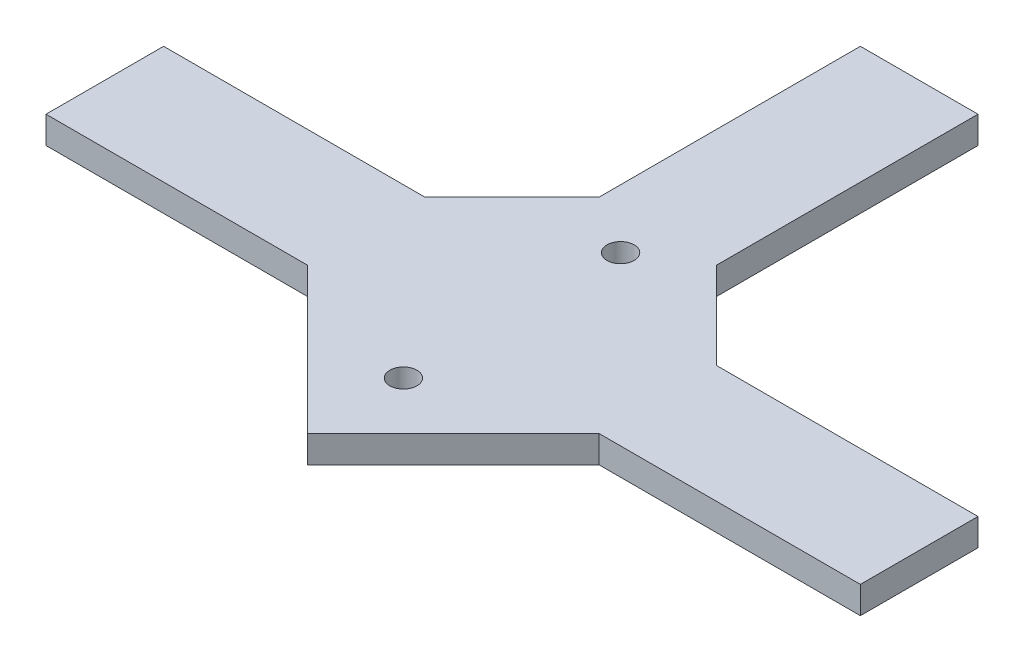
ISO-10303-21;
HEADER;
FILE_DESCRIPTION(('STEP AP214'),'2;1');
FILE_NAME('part.step','',(''),(''),'','','');
FILE_SCHEMA(('AUTOMOTIVE_DESIGN { 1 0 10303 214 1 1 1 1 }'));
ENDSEC;
DATA;
#1=APPLICATION_CONTEXT('core data for automotive mechanical design processes');
#2=APPLICATION_PROTOCOL_DEFINITION('international standard','automotive_design',2000,#1);
#3=PRODUCT_CONTEXT('',#1,'mechanical');
#4=PRODUCT('Part','Part','',(#3));
#5=PRODUCT_RELATED_PRODUCT_CATEGORY('part','',(#4));
#6=PRODUCT_DEFINITION_FORMATION('','',#4);
#7=PRODUCT_DEFINITION_CONTEXT('part definition',#1,'design');
#8=PRODUCT_DEFINITION('design','',#6,#7);
#9=PRODUCT_DEFINITION_SHAPE('','',#8);
#10=(LENGTH_UNIT() NAMED_UNIT(*) SI_UNIT(.MILLI.,.METRE.));
#11=(NAMED_UNIT(*) PLANE_ANGLE_UNIT() SI_UNIT($,.RADIAN.));
#12=(NAMED_UNIT(*) SI_UNIT($,.STERADIAN.) SOLID_ANGLE_UNIT());
#13=UNCERTAINTY_MEASURE_WITH_UNIT(LENGTH_MEASURE(1.E-05),#10,'distance_accuracy_value','');
#14=(GEOMETRIC_REPRESENTATION_CONTEXT(3) GLOBAL_UNCERTAINTY_ASSIGNED_CONTEXT((#13)) GLOBAL_UNIT_ASSIGNED_CONTEXT((#10,
#11,#12)) REPRESENTATION_CONTEXT('',''));
#15=CARTESIAN_POINT('',(0.,0.,0.));
#16=DIRECTION('',(0.,0.,1.));
#17=DIRECTION('',(1.,0.,0.));
#18=AXIS2_PLACEMENT_3D('',#15,#16,#17);
#19=CARTESIAN_POINT('',(11.3137084989848,3.,11.3137084989848));
#20=DIRECTION('',(0.707106781186547,0.,0.707106781186547));
#21=DIRECTION('',(0.707106781186548,0.,-0.707106781186548));
#22=AXIS2_PLACEMENT_3D('',#19,#20,#21);
#23=PLANE('',#22);
#24=DIRECTION('',(-0.707106781186548,0.,0.707106781186548));
#25=VECTOR('',#24,1.);
#26=CARTESIAN_POINT('',(11.3137084989848,0.,11.3137084989848));
#27=LINE('',#26,#25);
#28=CARTESIAN_POINT('',(16.1274169979695,0.,6.49999999999999));
#29=VERTEX_POINT('',#28);
#30=CARTESIAN_POINT('',(0.,0.,22.6274169979695));
#31=VERTEX_POINT('',#30);
#32=EDGE_CURVE('E165',#29,#31,#27,.T.);
#33=ORIENTED_EDGE('',*,*,#32,.F.);
#34=DIRECTION('',(0.,-1.,0.));
#35=VECTOR('',#34,1.);
#36=CARTESIAN_POINT('',(16.1274169979695,3.,6.49999999999999));
#37=LINE('',#36,#35);
#38=CARTESIAN_POINT('',(16.1274169979695,3.,6.49999999999999));
#39=VERTEX_POINT('',#38);
#40=EDGE_CURVE('E11',#39,#29,#37,.T.);
#41=ORIENTED_EDGE('',*,*,#40,.F.);
#42=DIRECTION('',(-0.707106781186548,0.,0.707106781186548));
#43=VECTOR('',#42,1.);
#44=CARTESIAN_POINT('',(11.3137084989848,3.,11.3137084989848));
#45=LINE('',#44,#43);
#46=CARTESIAN_POINT('',(0.,3.,22.6274169979695));
#47=VERTEX_POINT('',#46);
#48=EDGE_CURVE('E203',#39,#47,#45,.T.);
#49=ORIENTED_EDGE('',*,*,#48,.T.);
#50=DIRECTION('',(0.,-1.,0.));
#51=VECTOR('',#50,1.);
#52=CARTESIAN_POINT('',(0.,3.,22.6274169979695));
#53=LINE('',#52,#51);
#54=EDGE_CURVE('E99',#47,#31,#53,.T.);
#55=ORIENTED_EDGE('',*,*,#54,.T.);
#56=EDGE_LOOP('',(#33,#41,#49,#55));
#57=FACE_BOUND('',#56,.T.);
#58=ADVANCED_FACE('F34',(#57),#23,.T.);
#59=CARTESIAN_POINT('',(0.,3.,6.49999999999999));
#60=DIRECTION('',(0.,0.,-1.));
#61=DIRECTION('',(-1.,0.,0.));
#62=AXIS2_PLACEMENT_3D('',#59,#60,#61);
#63=PLANE('',#62);
#64=DIRECTION('',(1.,0.,0.));
#65=VECTOR('',#64,1.);
#66=CARTESIAN_POINT('',(0.,0.,6.49999999999999));
#67=LINE('',#66,#65);
#68=CARTESIAN_POINT('',(45.,0.,6.50000000000001));
#69=VERTEX_POINT('',#68);
#70=EDGE_CURVE('E168',#29,#69,#67,.T.);
#71=ORIENTED_EDGE('',*,*,#70,.T.);
#72=DIRECTION('',(0.,-1.,0.));
#73=VECTOR('',#72,1.);
#74=CARTESIAN_POINT('',(45.,3.,6.50000000000001));
#75=LINE('',#74,#73);
#76=CARTESIAN_POINT('',(45.,3.,6.50000000000001));
#77=VERTEX_POINT('',#76);
#78=EDGE_CURVE('E42',#77,#69,#75,.T.);
#79=ORIENTED_EDGE('',*,*,#78,.F.);
#80=DIRECTION('',(1.,0.,0.));
#81=VECTOR('',#80,1.);
#82=CARTESIAN_POINT('',(0.,3.,6.49999999999999));
#83=LINE('',#82,#81);
#84=EDGE_CURVE('E245',#39,#77,#83,.T.);
#85=ORIENTED_EDGE('',*,*,#84,.F.);
#86=ORIENTED_EDGE('',*,*,#40,.T.);
#87=EDGE_LOOP('',(#71,#79,#85,#86));
#88=FACE_BOUND('',#87,.T.);
#89=ADVANCED_FACE('F231',(#88),#63,.F.);
#90=CARTESIAN_POINT('',(45.,3.,0.));
#91=DIRECTION('',(1.,0.,0.));
#92=DIRECTION('',(0.,0.,-1.));
#93=AXIS2_PLACEMENT_3D('',#90,#91,#92);
#94=PLANE('',#93);
#95=DIRECTION('',(0.,0.,1.));
#96=VECTOR('',#95,1.);
#97=CARTESIAN_POINT('',(45.,0.,0.));
#98=LINE('',#97,#96);
#99=CARTESIAN_POINT('',(45.,0.,-6.50000000000001));
#100=VERTEX_POINT('',#99);
#101=EDGE_CURVE('E171',#100,#69,#98,.T.);
#102=ORIENTED_EDGE('',*,*,#101,.F.);
#103=DIRECTION('',(0.,-1.,0.));
#104=VECTOR('',#103,1.);
#105=CARTESIAN_POINT('',(45.,3.,-6.50000000000001));
#106=LINE('',#105,#104);
#107=CARTESIAN_POINT('',(45.,3.,-6.50000000000001));
#108=VERTEX_POINT('',#107);
#109=EDGE_CURVE('E221',#108,#100,#106,.T.);
#110=ORIENTED_EDGE('',*,*,#109,.F.);
#111=DIRECTION('',(0.,0.,1.));
#112=VECTOR('',#111,1.);
#113=CARTESIAN_POINT('',(45.,3.,0.));
#114=LINE('',#113,#112);
#115=EDGE_CURVE('E228',#108,#77,#114,.T.);
#116=ORIENTED_EDGE('',*,*,#115,.T.);
#117=ORIENTED_EDGE('',*,*,#78,.T.);
#118=EDGE_LOOP('',(#102,#110,#116,#117));
#119=FACE_BOUND('',#118,.T.);
#120=ADVANCED_FACE('F226',(#119),#94,.T.);
#121=CARTESIAN_POINT('',(0.,3.,-6.49999999999999));
#122=DIRECTION('',(0.,0.,-1.));
#123=DIRECTION('',(-1.,0.,0.));
#124=AXIS2_PLACEMENT_3D('',#121,#122,#123);
#125=PLANE('',#124);
#126=DIRECTION('',(1.,0.,0.));
#127=VECTOR('',#126,1.);
#128=CARTESIAN_POINT('',(0.,0.,-6.49999999999999));
#129=LINE('',#128,#127);
#130=CARTESIAN_POINT('',(16.1274169979695,0.,-6.49999999999999));
#131=VERTEX_POINT('',#130);
#132=EDGE_CURVE('E174',#131,#100,#129,.T.);
#133=ORIENTED_EDGE('',*,*,#132,.F.);
#134=DIRECTION('',(0.,-1.,0.));
#135=VECTOR('',#134,1.);
#136=CARTESIAN_POINT('',(16.1274169979695,3.,-6.49999999999999));
#137=LINE('',#136,#135);
#138=CARTESIAN_POINT('',(16.1274169979695,3.,-6.49999999999999));
#139=VERTEX_POINT('',#138);
#140=EDGE_CURVE('E219',#139,#131,#137,.T.);
#141=ORIENTED_EDGE('',*,*,#140,.F.);
#142=DIRECTION('',(1.,0.,0.));
#143=VECTOR('',#142,1.);
#144=CARTESIAN_POINT('',(0.,3.,-6.49999999999999));
#145=LINE('',#144,#143);
#146=EDGE_CURVE('E242',#139,#108,#145,.T.);
#147=ORIENTED_EDGE('',*,*,#146,.T.);
#148=ORIENTED_EDGE('',*,*,#109,.T.);
#149=EDGE_LOOP('',(#133,#141,#147,#148));
#150=FACE_BOUND('',#149,.T.);
#151=ADVANCED_FACE('F239',(#150),#125,.T.);
#152=CARTESIAN_POINT('',(11.3137084989848,3.,-11.3137084989848));
#153=DIRECTION('',(0.707106781186547,0.,-0.707106781186547));
#154=DIRECTION('',(-0.707106781186548,0.,-0.707106781186548));
#155=AXIS2_PLACEMENT_3D('',#152,#153,#154);
#156=PLANE('',#155);
#157=DIRECTION('',(0.707106781186548,0.,0.707106781186548));
#158=VECTOR('',#157,1.);
#159=CARTESIAN_POINT('',(11.3137084989848,0.,-11.3137084989848));
#160=LINE('',#159,#158);
#161=CARTESIAN_POINT('',(6.49999999999934,0.,-16.1274169979702));
#162=VERTEX_POINT('',#161);
#163=EDGE_CURVE('E177',#162,#131,#160,.T.);
#164=ORIENTED_EDGE('',*,*,#163,.F.);
#165=DIRECTION('',(0.,-1.,0.));
#166=VECTOR('',#165,1.);
#167=CARTESIAN_POINT('',(6.49999999999934,3.,-16.1274169979702));
#168=LINE('',#167,#166);
#169=CARTESIAN_POINT('',(6.49999999999934,3.,-16.1274169979702));
#170=VERTEX_POINT('',#169);
#171=EDGE_CURVE('E217',#170,#162,#168,.T.);
#172=ORIENTED_EDGE('',*,*,#171,.F.);
#173=DIRECTION('',(0.707106781186548,0.,0.707106781186548));
#174=VECTOR('',#173,1.);
#175=CARTESIAN_POINT('',(11.3137084989848,3.,-11.3137084989848));
#176=LINE('',#175,#174);
#177=EDGE_CURVE('E247',#170,#139,#176,.T.);
#178=ORIENTED_EDGE('',*,*,#177,.T.);
#179=ORIENTED_EDGE('',*,*,#140,.T.);
#180=EDGE_LOOP('',(#164,#172,#178,#179));
#181=FACE_BOUND('',#180,.T.);
#182=ADVANCED_FACE('F282',(#181),#156,.T.);
#183=CARTESIAN_POINT('',(6.49999999999906,3.,1.1013036593371E-13));
#184=DIRECTION('',(-1.,0.,0.));
#185=DIRECTION('',(0.,0.,1.));
#186=AXIS2_PLACEMENT_3D('',#183,#184,#185);
#187=PLANE('',#186);
#188=DIRECTION('',(0.,0.,-1.));
#189=VECTOR('',#188,1.);
#190=CARTESIAN_POINT('',(6.49999999999906,0.,1.1013036593371E-13));
#191=LINE('',#190,#189);
#192=CARTESIAN_POINT('',(6.49999999999982,0.,-45.0000000000021));
#193=VERTEX_POINT('',#192);
#194=EDGE_CURVE('E180',#162,#193,#191,.T.);
#195=ORIENTED_EDGE('',*,*,#194,.T.);
#196=DIRECTION('',(0.,-1.,0.));
#197=VECTOR('',#196,1.);
#198=CARTESIAN_POINT('',(6.49999999999982,3.,-45.0000000000021));
#199=LINE('',#198,#197);
#200=CARTESIAN_POINT('',(6.49999999999982,3.,-45.0000000000021));
#201=VERTEX_POINT('',#200);
#202=EDGE_CURVE('E214',#201,#193,#199,.T.);
#203=ORIENTED_EDGE('',*,*,#202,.F.);
#204=DIRECTION('',(0.,0.,-1.));
#205=VECTOR('',#204,1.);
#206=CARTESIAN_POINT('',(6.49999999999906,3.,1.1013036593371E-13));
#207=LINE('',#206,#205);
#208=EDGE_CURVE('E253',#170,#201,#207,.T.);
#209=ORIENTED_EDGE('',*,*,#208,.F.);
#210=ORIENTED_EDGE('',*,*,#171,.T.);
#211=EDGE_LOOP('',(#195,#203,#209,#210));
#212=FACE_BOUND('',#211,.T.);
#213=ADVANCED_FACE('F285',(#212),#187,.F.);
#214=CARTESIAN_POINT('',(7.68615940125147E-13,3.,-45.0000000000022));
#215=DIRECTION('',(0.,0.,1.));
#216=DIRECTION('',(1.,0.,0.));
#217=AXIS2_PLACEMENT_3D('',#214,#215,#216);
#218=PLANE('',#217);
#219=DIRECTION('',(-1.,0.,0.));
#220=VECTOR('',#219,1.);
#221=CARTESIAN_POINT('',(7.68615940125147E-13,0.,-45.0000000000022));
#222=LINE('',#221,#220);
#223=CARTESIAN_POINT('',(-6.50000000000017,0.,-45.0000000000024));
#224=VERTEX_POINT('',#223);
#225=EDGE_CURVE('E182',#193,#224,#222,.T.);
#226=ORIENTED_EDGE('',*,*,#225,.T.);
#227=DIRECTION('',(0.,-1.,0.));
#228=VECTOR('',#227,1.);
#229=CARTESIAN_POINT('',(-6.50000000000017,3.,-45.0000000000024));
#230=LINE('',#229,#228);
#231=CARTESIAN_POINT('',(-6.50000000000017,3.,-45.0000000000024));
#232=VERTEX_POINT('',#231);
#233=EDGE_CURVE('E212',#232,#224,#230,.T.);
#234=ORIENTED_EDGE('',*,*,#233,.F.);
#235=DIRECTION('',(-1.,0.,0.));
#236=VECTOR('',#235,1.);
#237=CARTESIAN_POINT('',(7.68615940125147E-13,3.,-45.0000000000022));
#238=LINE('',#237,#236);
#239=EDGE_CURVE('E255',#201,#232,#238,.T.);
#240=ORIENTED_EDGE('',*,*,#239,.F.);
#241=ORIENTED_EDGE('',*,*,#202,.T.);
#242=EDGE_LOOP('',(#226,#234,#240,#241));
#243=FACE_BOUND('',#242,.T.);
#244=ADVANCED_FACE('F289',(#243),#218,.F.);
#245=CARTESIAN_POINT('',(-6.50000000000094,3.,-1.11692498783866E-13));
#246=DIRECTION('',(-1.,0.,0.));
#247=DIRECTION('',(0.,0.,1.));
#248=AXIS2_PLACEMENT_3D('',#245,#246,#247);
#249=PLANE('',#248);
#250=DIRECTION('',(0.,0.,-1.));
#251=VECTOR('',#250,1.);
#252=CARTESIAN_POINT('',(-6.50000000000094,0.,-1.11692498783866E-13));
#253=LINE('',#252,#251);
#254=CARTESIAN_POINT('',(-6.50000000000066,0.,-16.1274169979689));
#255=VERTEX_POINT('',#254);
#256=EDGE_CURVE('E185',#255,#224,#253,.T.);
#257=ORIENTED_EDGE('',*,*,#256,.F.);
#258=DIRECTION('',(0.,-1.,0.));
#259=VECTOR('',#258,1.);
#260=CARTESIAN_POINT('',(-6.50000000000066,3.,-16.1274169979689));
#261=LINE('',#260,#259);
#262=CARTESIAN_POINT('',(-6.50000000000066,3.,-16.1274169979689));
#263=VERTEX_POINT('',#262);
#264=EDGE_CURVE('E210',#263,#255,#261,.T.);
#265=ORIENTED_EDGE('',*,*,#264,.F.);
#266=DIRECTION('',(0.,0.,-1.));
#267=VECTOR('',#266,1.);
#268=CARTESIAN_POINT('',(-6.50000000000094,3.,-1.11692498783866E-13));
#269=LINE('',#268,#267);
#270=EDGE_CURVE('E257',#263,#232,#269,.T.);
#271=ORIENTED_EDGE('',*,*,#270,.T.);
#272=ORIENTED_EDGE('',*,*,#233,.T.);
#273=EDGE_LOOP('',(#257,#265,#271,#272));
#274=FACE_BOUND('',#273,.T.);
#275=ADVANCED_FACE('F293',(#274),#249,.T.);
#276=CARTESIAN_POINT('',(-11.3137084989848,3.,-11.3137084989848));
#277=DIRECTION('',(0.707106781186547,0.,0.707106781186547));
#278=DIRECTION('',(0.707106781186548,0.,-0.707106781186548));
#279=AXIS2_PLACEMENT_3D('',#276,#277,#278);
#280=PLANE('',#279);
#281=DIRECTION('',(-0.707106781186548,0.,0.707106781186548));
#282=VECTOR('',#281,1.);
#283=CARTESIAN_POINT('',(-11.3137084989848,0.,-11.3137084989848));
#284=LINE('',#283,#282);
#285=CARTESIAN_POINT('',(-16.1274169979695,0.,-6.5));
#286=VERTEX_POINT('',#285);
#287=EDGE_CURVE('E188',#255,#286,#284,.T.);
#288=ORIENTED_EDGE('',*,*,#287,.T.);
#289=DIRECTION('',(0.,-1.,0.));
#290=VECTOR('',#289,1.);
#291=CARTESIAN_POINT('',(-16.1274169979695,3.,-6.5));
#292=LINE('',#291,#290);
#293=CARTESIAN_POINT('',(-16.1274169979695,3.,-6.5));
#294=VERTEX_POINT('',#293);
#295=EDGE_CURVE('E207',#294,#286,#292,.T.);
#296=ORIENTED_EDGE('',*,*,#295,.F.);
#297=DIRECTION('',(-0.707106781186548,0.,0.707106781186548));
#298=VECTOR('',#297,1.);
#299=CARTESIAN_POINT('',(-11.3137084989848,3.,-11.3137084989848));
#300=LINE('',#299,#298);
#301=EDGE_CURVE('E260',#263,#294,#300,.T.);
#302=ORIENTED_EDGE('',*,*,#301,.F.);
#303=ORIENTED_EDGE('',*,*,#264,.T.);
#304=EDGE_LOOP('',(#288,#296,#302,#303));
#305=FACE_BOUND('',#304,.T.);
#306=ADVANCED_FACE('F265',(#305),#280,.F.);
#307=CARTESIAN_POINT('',(0.,3.,-6.5));
#308=DIRECTION('',(0.,0.,1.));
#309=DIRECTION('',(1.,0.,0.));
#310=AXIS2_PLACEMENT_3D('',#307,#308,#309);
#311=PLANE('',#310);
#312=DIRECTION('',(-1.,0.,0.));
#313=VECTOR('',#312,1.);
#314=CARTESIAN_POINT('',(0.,0.,-6.5));
#315=LINE('',#314,#313);
#316=CARTESIAN_POINT('',(-45.,0.,-6.5));
#317=VERTEX_POINT('',#316);
#318=EDGE_CURVE('E190',#286,#317,#315,.T.);
#319=ORIENTED_EDGE('',*,*,#318,.T.);
#320=DIRECTION('',(0.,-1.,0.));
#321=VECTOR('',#320,1.);
#322=CARTESIAN_POINT('',(-45.,3.,-6.5));
#323=LINE('',#322,#321);
#324=CARTESIAN_POINT('',(-45.,3.,-6.5));
#325=VERTEX_POINT('',#324);
#326=EDGE_CURVE('E152',#325,#317,#323,.T.);
#327=ORIENTED_EDGE('',*,*,#326,.F.);
#328=DIRECTION('',(-1.,0.,0.));
#329=VECTOR('',#328,1.);
#330=CARTESIAN_POINT('',(0.,3.,-6.5));
#331=LINE('',#330,#329);
#332=EDGE_CURVE('E139',#294,#325,#331,.T.);
#333=ORIENTED_EDGE('',*,*,#332,.F.);
#334=ORIENTED_EDGE('',*,*,#295,.T.);
#335=EDGE_LOOP('',(#319,#327,#333,#334));
#336=FACE_BOUND('',#335,.T.);
#337=ADVANCED_FACE('F269',(#336),#311,.F.);
#338=CARTESIAN_POINT('',(-45.,3.,0.));
#339=DIRECTION('',(1.,0.,0.));
#340=DIRECTION('',(0.,0.,-1.));
#341=AXIS2_PLACEMENT_3D('',#338,#339,#340);
#342=PLANE('',#341);
#343=DIRECTION('',(0.,0.,1.));
#344=VECTOR('',#343,1.);
#345=CARTESIAN_POINT('',(-45.,0.,0.));
#346=LINE('',#345,#344);
#347=CARTESIAN_POINT('',(-45.,0.,6.5));
#348=VERTEX_POINT('',#347);
#349=EDGE_CURVE('E148',#317,#348,#346,.T.);
#350=ORIENTED_EDGE('',*,*,#349,.T.);
#351=DIRECTION('',(0.,-1.,0.));
#352=VECTOR('',#351,1.);
#353=CARTESIAN_POINT('',(-45.,3.,6.5));
#354=LINE('',#353,#352);
#355=CARTESIAN_POINT('',(-45.,3.,6.5));
#356=VERTEX_POINT('',#355);
#357=EDGE_CURVE('E145',#356,#348,#354,.T.);
#358=ORIENTED_EDGE('',*,*,#357,.F.);
#359=DIRECTION('',(0.,0.,1.));
#360=VECTOR('',#359,1.);
#361=CARTESIAN_POINT('',(-45.,3.,0.));
#362=LINE('',#361,#360);
#363=EDGE_CURVE('E132',#325,#356,#362,.T.);
#364=ORIENTED_EDGE('',*,*,#363,.F.);
#365=ORIENTED_EDGE('',*,*,#326,.T.);
#366=EDGE_LOOP('',(#350,#358,#364,#365));
#367=FACE_BOUND('',#366,.T.);
#368=ADVANCED_FACE('F146',(#367),#342,.F.);
#369=CARTESIAN_POINT('',(0.,3.,6.5));
#370=DIRECTION('',(0.,0.,1.));
#371=DIRECTION('',(1.,0.,0.));
#372=AXIS2_PLACEMENT_3D('',#369,#370,#371);
#373=PLANE('',#372);
#374=DIRECTION('',(-1.,0.,0.));
#375=VECTOR('',#374,1.);
#376=CARTESIAN_POINT('',(0.,0.,6.5));
#377=LINE('',#376,#375);
#378=CARTESIAN_POINT('',(-16.1274169979695,0.,6.5));
#379=VERTEX_POINT('',#378);
#380=EDGE_CURVE('E193',#379,#348,#377,.T.);
#381=ORIENTED_EDGE('',*,*,#380,.F.);
#382=DIRECTION('',(0.,-1.,0.));
#383=VECTOR('',#382,1.);
#384=CARTESIAN_POINT('',(-16.1274169979695,3.,6.5));
#385=LINE('',#384,#383);
#386=CARTESIAN_POINT('',(-16.1274169979695,3.,6.5));
#387=VERTEX_POINT('',#386);
#388=EDGE_CURVE('E92',#387,#379,#385,.T.);
#389=ORIENTED_EDGE('',*,*,#388,.F.);
#390=DIRECTION('',(-1.,0.,0.));
#391=VECTOR('',#390,1.);
#392=CARTESIAN_POINT('',(0.,3.,6.5));
#393=LINE('',#392,#391);
#394=EDGE_CURVE('E137',#387,#356,#393,.T.);
#395=ORIENTED_EDGE('',*,*,#394,.T.);
#396=ORIENTED_EDGE('',*,*,#357,.T.);
#397=EDGE_LOOP('',(#381,#389,#395,#396));
#398=FACE_BOUND('',#397,.T.);
#399=ADVANCED_FACE('F154',(#398),#373,.T.);
#400=CARTESIAN_POINT('',(0.,3.,12.));
#401=DIRECTION('',(0.,-1.,0.));
#402=DIRECTION('',(0.,0.,-1.));
#403=AXIS2_PLACEMENT_3D('',#400,#401,#402);
#404=CYLINDRICAL_SURFACE('',#403,1.5);
#405=CARTESIAN_POINT('',(0.,3.,12.));
#406=DIRECTION('',(0.,1.,0.));
#407=DIRECTION('',(0.,0.,1.));
#408=AXIS2_PLACEMENT_3D('',#405,#406,#407);
#409=CIRCLE('',#408,1.5);
#410=CARTESIAN_POINT('',(0.,3.,13.5));
#411=VERTEX_POINT('',#410);
#412=EDGE_CURVE('E156',#411,#411,#409,.T.);
#413=ORIENTED_EDGE('',*,*,#412,.T.);
#414=EDGE_LOOP('',(#413));
#415=FACE_BOUND('',#414,.T.);
#416=CARTESIAN_POINT('',(0.,0.,12.));
#417=DIRECTION('',(0.,1.,0.));
#418=DIRECTION('',(0.,0.,1.));
#419=AXIS2_PLACEMENT_3D('',#416,#417,#418);
#420=CIRCLE('',#419,1.5);
#421=CARTESIAN_POINT('',(0.,0.,13.5));
#422=VERTEX_POINT('',#421);
#423=EDGE_CURVE('E197',#422,#422,#420,.T.);
#424=ORIENTED_EDGE('',*,*,#423,.F.);
#425=EDGE_LOOP('',(#424));
#426=FACE_BOUND('',#425,.T.);
#427=ADVANCED_FACE('F306',(#415,#426),#404,.F.);
#428=CARTESIAN_POINT('',(-11.3137084989848,3.,11.3137084989848));
#429=DIRECTION('',(0.707106781186547,0.,-0.707106781186547));
#430=DIRECTION('',(-0.707106781186548,0.,-0.707106781186548));
#431=AXIS2_PLACEMENT_3D('',#428,#429,#430);
#432=PLANE('',#431);
#433=DIRECTION('',(0.707106781186548,0.,0.707106781186548));
#434=VECTOR('',#433,1.);
#435=CARTESIAN_POINT('',(-11.3137084989848,0.,11.3137084989848));
#436=LINE('',#435,#434);
#437=EDGE_CURVE('E195',#379,#31,#436,.T.);
#438=ORIENTED_EDGE('',*,*,#437,.T.);
#439=ORIENTED_EDGE('',*,*,#54,.F.);
#440=DIRECTION('',(0.707106781186548,0.,0.707106781186548));
#441=VECTOR('',#440,1.);
#442=CARTESIAN_POINT('',(-11.3137084989848,3.,11.3137084989848));
#443=LINE('',#442,#441);
#444=EDGE_CURVE('E50',#387,#47,#443,.T.);
#445=ORIENTED_EDGE('',*,*,#444,.F.);
#446=ORIENTED_EDGE('',*,*,#388,.T.);
#447=EDGE_LOOP('',(#438,#439,#445,#446));
#448=FACE_BOUND('',#447,.T.);
#449=ADVANCED_FACE('F270',(#448),#432,.F.);
#450=CARTESIAN_POINT('',(0.,3.,-12.));
#451=DIRECTION('',(0.,-1.,0.));
#452=DIRECTION('',(0.,0.,-1.));
#453=AXIS2_PLACEMENT_3D('',#450,#451,#452);
#454=CYLINDRICAL_SURFACE('',#453,1.5);
#455=CARTESIAN_POINT('',(0.,3.,-12.));
#456=DIRECTION('',(0.,1.,0.));
#457=DIRECTION('',(0.,0.,1.));
#458=AXIS2_PLACEMENT_3D('',#455,#456,#457);
#459=CIRCLE('',#458,1.5);
#460=CARTESIAN_POINT('',(0.,3.,-10.5));
#461=VERTEX_POINT('',#460);
#462=EDGE_CURVE('E162',#461,#461,#459,.T.);
#463=ORIENTED_EDGE('',*,*,#462,.T.);
#464=EDGE_LOOP('',(#463));
#465=FACE_BOUND('',#464,.T.);
#466=CARTESIAN_POINT('',(0.,0.,-12.));
#467=DIRECTION('',(0.,1.,0.));
#468=DIRECTION('',(0.,0.,1.));
#469=AXIS2_PLACEMENT_3D('',#466,#467,#468);
#470=CIRCLE('',#469,1.5);
#471=CARTESIAN_POINT('',(0.,0.,-10.5));
#472=VERTEX_POINT('',#471);
#473=EDGE_CURVE('E200',#472,#472,#470,.T.);
#474=ORIENTED_EDGE('',*,*,#473,.F.);
#475=EDGE_LOOP('',(#474));
#476=FACE_BOUND('',#475,.T.);
#477=ADVANCED_FACE('F309',(#465,#476),#454,.F.);
#478=CARTESIAN_POINT('',(0.,3.,0.));
#479=DIRECTION('',(0.,1.,0.));
#480=DIRECTION('',(0.,0.,1.));
#481=AXIS2_PLACEMENT_3D('',#478,#479,#480);
#482=PLANE('',#481);
#483=ORIENTED_EDGE('',*,*,#48,.F.);
#484=ORIENTED_EDGE('',*,*,#84,.T.);
#485=ORIENTED_EDGE('',*,*,#115,.F.);
#486=ORIENTED_EDGE('',*,*,#146,.F.);
#487=ORIENTED_EDGE('',*,*,#177,.F.);
#488=ORIENTED_EDGE('',*,*,#208,.T.);
#489=ORIENTED_EDGE('',*,*,#239,.T.);
#490=ORIENTED_EDGE('',*,*,#270,.F.);
#491=ORIENTED_EDGE('',*,*,#301,.T.);
#492=ORIENTED_EDGE('',*,*,#332,.T.);
#493=ORIENTED_EDGE('',*,*,#363,.T.);
#494=ORIENTED_EDGE('',*,*,#394,.F.);
#495=ORIENTED_EDGE('',*,*,#444,.T.);
#496=EDGE_LOOP('',(#483,#484,#485,#486,#487,#488,#489,#490,#491,#492,#493,#494,#495));
#497=FACE_BOUND('',#496,.T.);
#498=ORIENTED_EDGE('',*,*,#412,.F.);
#499=EDGE_LOOP('',(#498));
#500=FACE_BOUND('',#499,.T.);
#501=ORIENTED_EDGE('',*,*,#462,.F.);
#502=EDGE_LOOP('',(#501));
#503=FACE_BOUND('',#502,.T.);
#504=ADVANCED_FACE('F134',(#497,#500,#503),#482,.T.);
#505=CARTESIAN_POINT('',(0.,0.,0.));
#506=DIRECTION('',(0.,1.,0.));
#507=DIRECTION('',(0.,0.,1.));
#508=AXIS2_PLACEMENT_3D('',#505,#506,#507);
#509=PLANE('',#508);
#510=ORIENTED_EDGE('',*,*,#32,.T.);
#511=ORIENTED_EDGE('',*,*,#437,.F.);
#512=ORIENTED_EDGE('',*,*,#380,.T.);
#513=ORIENTED_EDGE('',*,*,#349,.F.);
#514=ORIENTED_EDGE('',*,*,#318,.F.);
#515=ORIENTED_EDGE('',*,*,#287,.F.);
#516=ORIENTED_EDGE('',*,*,#256,.T.);
#517=ORIENTED_EDGE('',*,*,#225,.F.);
#518=ORIENTED_EDGE('',*,*,#194,.F.);
#519=ORIENTED_EDGE('',*,*,#163,.T.);
#520=ORIENTED_EDGE('',*,*,#132,.T.);
#521=ORIENTED_EDGE('',*,*,#101,.T.);
#522=ORIENTED_EDGE('',*,*,#70,.F.);
#523=EDGE_LOOP('',(#510,#511,#512,#513,#514,#515,#516,#517,#518,#519,#520,#521,#522));
#524=FACE_BOUND('',#523,.T.);
#525=ORIENTED_EDGE('',*,*,#423,.T.);
#526=EDGE_LOOP('',(#525));
#527=FACE_BOUND('',#526,.T.);
#528=ORIENTED_EDGE('',*,*,#473,.T.);
#529=EDGE_LOOP('',(#528));
#530=FACE_BOUND('',#529,.T.);
#531=ADVANCED_FACE('F233',(#524,#527,#530),#509,.F.);
#532=CLOSED_SHELL('',(#58,#89,#120,#151,#182,#213,#244,#275,#306,#337,#368,#399,#427,#449,#477,
#504,#531));
#533=MANIFOLD_SOLID_BREP('B2',#532);
#534=ADVANCED_BREP_SHAPE_REPRESENTATION('',(#18,#533),#14);
#535=SHAPE_DEFINITION_REPRESENTATION(#9,#534);
ENDSEC;
END-ISO-10303-21;
